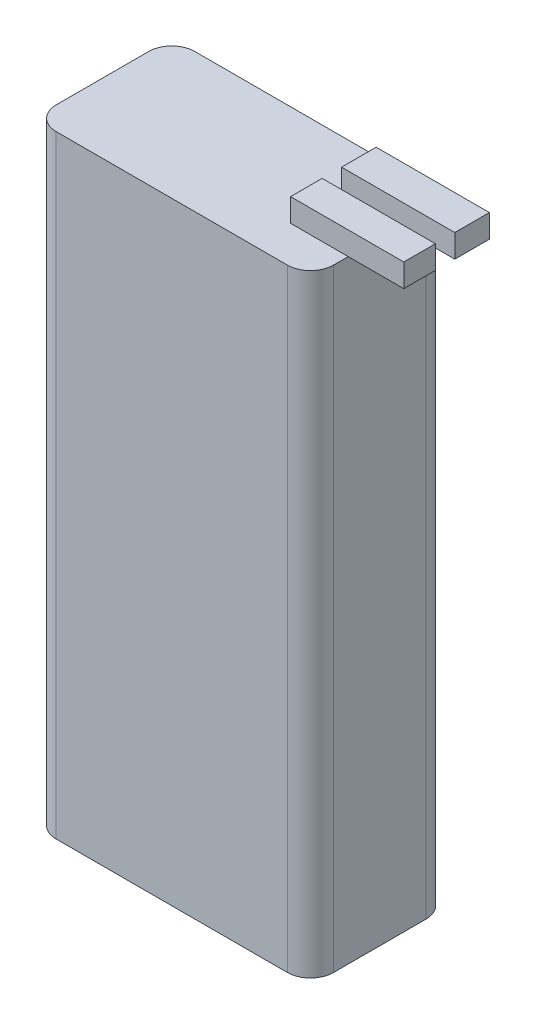
ISO-10303-21;
HEADER;
FILE_DESCRIPTION(('STEP AP214'),'2;1');
FILE_NAME('part.step','',(''),(''),'','','');
FILE_SCHEMA(('AUTOMOTIVE_DESIGN { 1 0 10303 214 1 1 1 1 }'));
ENDSEC;
DATA;
#1=APPLICATION_CONTEXT('core data for automotive mechanical design processes');
#2=APPLICATION_PROTOCOL_DEFINITION('international standard','automotive_design',2000,#1);
#3=PRODUCT_CONTEXT('',#1,'mechanical');
#4=PRODUCT('Part','Part','',(#3));
#5=PRODUCT_RELATED_PRODUCT_CATEGORY('part','',(#4));
#6=PRODUCT_DEFINITION_FORMATION('','',#4);
#7=PRODUCT_DEFINITION_CONTEXT('part definition',#1,'design');
#8=PRODUCT_DEFINITION('design','',#6,#7);
#9=PRODUCT_DEFINITION_SHAPE('','',#8);
#10=(LENGTH_UNIT() NAMED_UNIT(*) SI_UNIT(.MILLI.,.METRE.));
#11=(NAMED_UNIT(*) PLANE_ANGLE_UNIT() SI_UNIT($,.RADIAN.));
#12=(NAMED_UNIT(*) SI_UNIT($,.STERADIAN.) SOLID_ANGLE_UNIT());
#13=UNCERTAINTY_MEASURE_WITH_UNIT(LENGTH_MEASURE(1.E-05),#10,'distance_accuracy_value','');
#14=(GEOMETRIC_REPRESENTATION_CONTEXT(3) GLOBAL_UNCERTAINTY_ASSIGNED_CONTEXT((#13)) GLOBAL_UNIT_ASSIGNED_CONTEXT((#10,
#11,#12)) REPRESENTATION_CONTEXT('',''));
#15=CARTESIAN_POINT('',(0.,0.,0.));
#16=DIRECTION('',(0.,0.,1.));
#17=DIRECTION('',(1.,0.,0.));
#18=AXIS2_PLACEMENT_3D('',#15,#16,#17);
#19=CARTESIAN_POINT('',(10.,53.,4.));
#20=DIRECTION('',(0.,-1.,0.));
#21=DIRECTION('',(0.,0.,-1.));
#22=AXIS2_PLACEMENT_3D('',#19,#20,#21);
#23=PLANE('',#22);
#24=DIRECTION('',(1.,0.,0.));
#25=VECTOR('',#24,1.);
#26=CARTESIAN_POINT('',(7.01123998022979,53.,2.73246619331502));
#27=LINE('',#26,#25);
#28=CARTESIAN_POINT('',(7.01123998022979,53.,2.73246619331502));
#29=VERTEX_POINT('',#28);
#30=CARTESIAN_POINT('',(12.,53.,2.73246619331502));
#31=VERTEX_POINT('',#30);
#32=EDGE_CURVE('E57',#29,#31,#27,.T.);
#33=ORIENTED_EDGE('',*,*,#32,.F.);
#34=DIRECTION('',(0.,0.,1.));
#35=VECTOR('',#34,1.);
#36=CARTESIAN_POINT('',(7.01123998022979,53.,0.));
#37=LINE('',#36,#35);
#38=CARTESIAN_POINT('',(7.01123998022979,53.,0.));
#39=VERTEX_POINT('',#38);
#40=EDGE_CURVE('E62',#39,#29,#37,.T.);
#41=ORIENTED_EDGE('',*,*,#40,.F.);
#42=DIRECTION('',(-1.,0.,0.));
#43=VECTOR('',#42,1.);
#44=CARTESIAN_POINT('',(7.01123998022979,53.,0.));
#45=LINE('',#44,#43);
#46=CARTESIAN_POINT('',(12.,53.,0.));
#47=VERTEX_POINT('',#46);
#48=EDGE_CURVE('E379',#47,#39,#45,.T.);
#49=ORIENTED_EDGE('',*,*,#48,.F.);
#50=DIRECTION('',(0.,0.,-1.));
#51=VECTOR('',#50,1.);
#52=CARTESIAN_POINT('',(12.,53.,-3.99999999999999));
#53=LINE('',#52,#51);
#54=CARTESIAN_POINT('',(12.,53.,-1.67949374869636));
#55=VERTEX_POINT('',#54);
#56=EDGE_CURVE('E253',#47,#55,#53,.T.);
#57=ORIENTED_EDGE('',*,*,#56,.T.);
#58=DIRECTION('',(1.,0.,0.));
#59=VECTOR('',#58,1.);
#60=CARTESIAN_POINT('',(7.01123998022979,53.,-1.67949374869636));
#61=LINE('',#60,#59);
#62=CARTESIAN_POINT('',(7.01123998022979,53.,-1.67949374869636));
#63=VERTEX_POINT('',#62);
#64=EDGE_CURVE('E217',#63,#55,#61,.T.);
#65=ORIENTED_EDGE('',*,*,#64,.F.);
#66=DIRECTION('',(0.,0.,1.));
#67=VECTOR('',#66,1.);
#68=CARTESIAN_POINT('',(7.01123998022979,53.,-4.67261016044063));
#69=LINE('',#68,#67);
#70=CARTESIAN_POINT('',(7.01123998022979,53.,-4.67261016044063));
#71=VERTEX_POINT('',#70);
#72=EDGE_CURVE('E192',#71,#63,#69,.T.);
#73=ORIENTED_EDGE('',*,*,#72,.F.);
#74=DIRECTION('',(-1.,0.,0.));
#75=VECTOR('',#74,1.);
#76=CARTESIAN_POINT('',(7.01123998022979,53.,-4.67261016044063));
#77=LINE('',#76,#75);
#78=CARTESIAN_POINT('',(11.8835061911425,53.,-4.67261016044063));
#79=VERTEX_POINT('',#78);
#80=EDGE_CURVE('E11',#79,#71,#77,.T.);
#81=ORIENTED_EDGE('',*,*,#80,.F.);
#82=CARTESIAN_POINT('',(10.,53.,-4.));
#83=DIRECTION('',(0.,1.,0.));
#84=DIRECTION('',(0.,0.,1.));
#85=AXIS2_PLACEMENT_3D('',#82,#83,#84);
#86=CIRCLE('',#85,2.);
#87=CARTESIAN_POINT('',(9.99999999999999,53.,-6.));
#88=VERTEX_POINT('',#87);
#89=EDGE_CURVE('E251',#79,#88,#86,.T.);
#90=ORIENTED_EDGE('',*,*,#89,.T.);
#91=DIRECTION('',(-1.,0.,0.));
#92=VECTOR('',#91,1.);
#93=CARTESIAN_POINT('',(-9.99999999999999,53.,-6.));
#94=LINE('',#93,#92);
#95=CARTESIAN_POINT('',(-9.99999999999999,53.,-6.));
#96=VERTEX_POINT('',#95);
#97=EDGE_CURVE('E258',#88,#96,#94,.T.);
#98=ORIENTED_EDGE('',*,*,#97,.T.);
#99=CARTESIAN_POINT('',(-10.,53.,-4.));
#100=DIRECTION('',(0.,1.,0.));
#101=DIRECTION('',(0.,0.,-1.));
#102=AXIS2_PLACEMENT_3D('',#99,#100,#101);
#103=CIRCLE('',#102,2.);
#104=CARTESIAN_POINT('',(-12.,53.,-3.99999999999999));
#105=VERTEX_POINT('',#104);
#106=EDGE_CURVE('E261',#96,#105,#103,.T.);
#107=ORIENTED_EDGE('',*,*,#106,.T.);
#108=DIRECTION('',(0.,0.,1.));
#109=VECTOR('',#108,1.);
#110=CARTESIAN_POINT('',(-12.,53.,-3.99999999999999));
#111=LINE('',#110,#109);
#112=CARTESIAN_POINT('',(-12.,53.,3.99999999999999));
#113=VERTEX_POINT('',#112);
#114=EDGE_CURVE('E264',#105,#113,#111,.T.);
#115=ORIENTED_EDGE('',*,*,#114,.T.);
#116=CARTESIAN_POINT('',(-10.,53.,4.));
#117=DIRECTION('',(0.,1.,0.));
#118=DIRECTION('',(0.,0.,-1.));
#119=AXIS2_PLACEMENT_3D('',#116,#117,#118);
#120=CIRCLE('',#119,2.);
#121=CARTESIAN_POINT('',(-9.99999999999999,53.,6.));
#122=VERTEX_POINT('',#121);
#123=EDGE_CURVE('E267',#113,#122,#120,.T.);
#124=ORIENTED_EDGE('',*,*,#123,.T.);
#125=DIRECTION('',(1.,0.,0.));
#126=VECTOR('',#125,1.);
#127=CARTESIAN_POINT('',(-9.99999999999999,53.,6.));
#128=LINE('',#127,#126);
#129=CARTESIAN_POINT('',(9.99999999999999,53.,6.));
#130=VERTEX_POINT('',#129);
#131=EDGE_CURVE('E270',#122,#130,#128,.T.);
#132=ORIENTED_EDGE('',*,*,#131,.T.);
#133=CARTESIAN_POINT('',(10.,53.,4.));
#134=DIRECTION('',(0.,1.,0.));
#135=DIRECTION('',(0.,0.,-1.));
#136=AXIS2_PLACEMENT_3D('',#133,#134,#135);
#137=CIRCLE('',#136,2.);
#138=CARTESIAN_POINT('',(12.,53.,3.99999999999999));
#139=VERTEX_POINT('',#138);
#140=EDGE_CURVE('E242',#130,#139,#137,.T.);
#141=ORIENTED_EDGE('',*,*,#140,.T.);
#142=EDGE_CURVE('E248',#139,#31,#53,.T.);
#143=ORIENTED_EDGE('',*,*,#142,.T.);
#144=EDGE_LOOP('',(#33,#41,#49,#57,#65,#73,#81,#90,#98,#107,#115,#124,#132,#141,#143));
#145=FACE_BOUND('',#144,.T.);
#146=ADVANCED_FACE('F39',(#145),#23,.F.);
#147=CARTESIAN_POINT('',(10.,53.,4.));
#148=DIRECTION('',(0.,-1.,0.));
#149=DIRECTION('',(0.,0.,-1.));
#150=AXIS2_PLACEMENT_3D('',#147,#148,#149);
#151=CYLINDRICAL_SURFACE('',#150,2.);
#152=CARTESIAN_POINT('',(10.,0.,4.));
#153=DIRECTION('',(0.,1.,0.));
#154=DIRECTION('',(0.,0.,-1.));
#155=AXIS2_PLACEMENT_3D('',#152,#153,#154);
#156=CIRCLE('',#155,2.);
#157=CARTESIAN_POINT('',(9.99999999999999,0.,6.));
#158=VERTEX_POINT('',#157);
#159=CARTESIAN_POINT('',(12.,0.,3.99999999999999));
#160=VERTEX_POINT('',#159);
#161=EDGE_CURVE('E241',#158,#160,#156,.T.);
#162=ORIENTED_EDGE('',*,*,#161,.T.);
#163=DIRECTION('',(0.,-1.,0.));
#164=VECTOR('',#163,1.);
#165=CARTESIAN_POINT('',(12.,53.,3.99999999999999));
#166=LINE('',#165,#164);
#167=EDGE_CURVE('E43',#139,#160,#166,.T.);
#168=ORIENTED_EDGE('',*,*,#167,.F.);
#169=ORIENTED_EDGE('',*,*,#140,.F.);
#170=DIRECTION('',(0.,-1.,0.));
#171=VECTOR('',#170,1.);
#172=CARTESIAN_POINT('',(9.99999999999999,53.,6.));
#173=LINE('',#172,#171);
#174=EDGE_CURVE('E273',#130,#158,#173,.T.);
#175=ORIENTED_EDGE('',*,*,#174,.T.);
#176=EDGE_LOOP('',(#162,#168,#169,#175));
#177=FACE_BOUND('',#176,.T.);
#178=ADVANCED_FACE('F41',(#177),#151,.T.);
#179=CARTESIAN_POINT('',(12.,53.,-3.99999999999999));
#180=DIRECTION('',(-1.,0.,0.));
#181=DIRECTION('',(0.,0.,1.));
#182=AXIS2_PLACEMENT_3D('',#179,#180,#181);
#183=PLANE('',#182);
#184=DIRECTION('',(0.,0.,-1.));
#185=VECTOR('',#184,1.);
#186=CARTESIAN_POINT('',(12.,0.,-3.99999999999999));
#187=LINE('',#186,#185);
#188=CARTESIAN_POINT('',(12.,0.,-3.99999999999999));
#189=VERTEX_POINT('',#188);
#190=EDGE_CURVE('E277',#160,#189,#187,.T.);
#191=ORIENTED_EDGE('',*,*,#190,.T.);
#192=DIRECTION('',(0.,-1.,0.));
#193=VECTOR('',#192,1.);
#194=CARTESIAN_POINT('',(12.,53.,-3.99999999999999));
#195=LINE('',#194,#193);
#196=CARTESIAN_POINT('',(12.,53.,-3.99999999999999));
#197=VERTEX_POINT('',#196);
#198=EDGE_CURVE('E319',#197,#189,#195,.T.);
#199=ORIENTED_EDGE('',*,*,#198,.F.);
#200=EDGE_CURVE('E246',#55,#197,#53,.T.);
#201=ORIENTED_EDGE('',*,*,#200,.F.);
#202=ORIENTED_EDGE('',*,*,#56,.F.);
#203=EDGE_CURVE('E252',#31,#47,#53,.T.);
#204=ORIENTED_EDGE('',*,*,#203,.F.);
#205=ORIENTED_EDGE('',*,*,#142,.F.);
#206=ORIENTED_EDGE('',*,*,#167,.T.);
#207=EDGE_LOOP('',(#191,#199,#201,#202,#204,#205,#206));
#208=FACE_BOUND('',#207,.T.);
#209=ADVANCED_FACE('F329',(#208),#183,.F.);
#210=CARTESIAN_POINT('',(10.,53.,-4.));
#211=DIRECTION('',(0.,-1.,0.));
#212=DIRECTION('',(0.,0.,-1.));
#213=AXIS2_PLACEMENT_3D('',#210,#211,#212);
#214=CYLINDRICAL_SURFACE('',#213,2.);
#215=CARTESIAN_POINT('',(10.,0.,-4.));
#216=DIRECTION('',(0.,1.,0.));
#217=DIRECTION('',(0.,0.,1.));
#218=AXIS2_PLACEMENT_3D('',#215,#216,#217);
#219=CIRCLE('',#218,2.);
#220=CARTESIAN_POINT('',(9.99999999999999,0.,-6.));
#221=VERTEX_POINT('',#220);
#222=EDGE_CURVE('E280',#189,#221,#219,.T.);
#223=ORIENTED_EDGE('',*,*,#222,.T.);
#224=DIRECTION('',(0.,-1.,0.));
#225=VECTOR('',#224,1.);
#226=CARTESIAN_POINT('',(9.99999999999999,53.,-6.));
#227=LINE('',#226,#225);
#228=EDGE_CURVE('E316',#88,#221,#227,.T.);
#229=ORIENTED_EDGE('',*,*,#228,.F.);
#230=ORIENTED_EDGE('',*,*,#89,.F.);
#231=EDGE_CURVE('E254',#197,#79,#86,.T.);
#232=ORIENTED_EDGE('',*,*,#231,.F.);
#233=ORIENTED_EDGE('',*,*,#198,.T.);
#234=EDGE_LOOP('',(#223,#229,#230,#232,#233));
#235=FACE_BOUND('',#234,.T.);
#236=ADVANCED_FACE('F341',(#235),#214,.T.);
#237=CARTESIAN_POINT('',(-9.99999999999999,53.,-6.));
#238=DIRECTION('',(0.,0.,1.));
#239=DIRECTION('',(1.,0.,0.));
#240=AXIS2_PLACEMENT_3D('',#237,#238,#239);
#241=PLANE('',#240);
#242=DIRECTION('',(-1.,0.,0.));
#243=VECTOR('',#242,1.);
#244=CARTESIAN_POINT('',(-9.99999999999999,0.,-6.));
#245=LINE('',#244,#243);
#246=CARTESIAN_POINT('',(-9.99999999999999,0.,-6.));
#247=VERTEX_POINT('',#246);
#248=EDGE_CURVE('E283',#221,#247,#245,.T.);
#249=ORIENTED_EDGE('',*,*,#248,.T.);
#250=DIRECTION('',(0.,-1.,0.));
#251=VECTOR('',#250,1.);
#252=CARTESIAN_POINT('',(-9.99999999999999,53.,-6.));
#253=LINE('',#252,#251);
#254=EDGE_CURVE('E312',#96,#247,#253,.T.);
#255=ORIENTED_EDGE('',*,*,#254,.F.);
#256=ORIENTED_EDGE('',*,*,#97,.F.);
#257=ORIENTED_EDGE('',*,*,#228,.T.);
#258=EDGE_LOOP('',(#249,#255,#256,#257));
#259=FACE_BOUND('',#258,.T.);
#260=ADVANCED_FACE('F345',(#259),#241,.F.);
#261=CARTESIAN_POINT('',(-10.,53.,-4.));
#262=DIRECTION('',(0.,-1.,0.));
#263=DIRECTION('',(0.,0.,-1.));
#264=AXIS2_PLACEMENT_3D('',#261,#262,#263);
#265=CYLINDRICAL_SURFACE('',#264,2.);
#266=CARTESIAN_POINT('',(-10.,0.,-4.));
#267=DIRECTION('',(0.,1.,0.));
#268=DIRECTION('',(0.,0.,-1.));
#269=AXIS2_PLACEMENT_3D('',#266,#267,#268);
#270=CIRCLE('',#269,2.);
#271=CARTESIAN_POINT('',(-12.,0.,-3.99999999999999));
#272=VERTEX_POINT('',#271);
#273=EDGE_CURVE('E286',#247,#272,#270,.T.);
#274=ORIENTED_EDGE('',*,*,#273,.T.);
#275=DIRECTION('',(0.,-1.,0.));
#276=VECTOR('',#275,1.);
#277=CARTESIAN_POINT('',(-12.,53.,-3.99999999999999));
#278=LINE('',#277,#276);
#279=EDGE_CURVE('E308',#105,#272,#278,.T.);
#280=ORIENTED_EDGE('',*,*,#279,.F.);
#281=ORIENTED_EDGE('',*,*,#106,.F.);
#282=ORIENTED_EDGE('',*,*,#254,.T.);
#283=EDGE_LOOP('',(#274,#280,#281,#282));
#284=FACE_BOUND('',#283,.T.);
#285=ADVANCED_FACE('F440',(#284),#265,.T.);
#286=CARTESIAN_POINT('',(-12.,53.,-3.99999999999999));
#287=DIRECTION('',(1.,0.,0.));
#288=DIRECTION('',(0.,0.,-1.));
#289=AXIS2_PLACEMENT_3D('',#286,#287,#288);
#290=PLANE('',#289);
#291=DIRECTION('',(0.,0.,1.));
#292=VECTOR('',#291,1.);
#293=CARTESIAN_POINT('',(-12.,0.,-3.99999999999999));
#294=LINE('',#293,#292);
#295=CARTESIAN_POINT('',(-12.,0.,3.99999999999999));
#296=VERTEX_POINT('',#295);
#297=EDGE_CURVE('E289',#272,#296,#294,.T.);
#298=ORIENTED_EDGE('',*,*,#297,.T.);
#299=DIRECTION('',(0.,-1.,0.));
#300=VECTOR('',#299,1.);
#301=CARTESIAN_POINT('',(-12.,53.,3.99999999999999));
#302=LINE('',#301,#300);
#303=EDGE_CURVE('E304',#113,#296,#302,.T.);
#304=ORIENTED_EDGE('',*,*,#303,.F.);
#305=ORIENTED_EDGE('',*,*,#114,.F.);
#306=ORIENTED_EDGE('',*,*,#279,.T.);
#307=EDGE_LOOP('',(#298,#304,#305,#306));
#308=FACE_BOUND('',#307,.T.);
#309=ADVANCED_FACE('F436',(#308),#290,.F.);
#310=CARTESIAN_POINT('',(-10.,53.,4.));
#311=DIRECTION('',(0.,-1.,0.));
#312=DIRECTION('',(0.,0.,-1.));
#313=AXIS2_PLACEMENT_3D('',#310,#311,#312);
#314=CYLINDRICAL_SURFACE('',#313,2.);
#315=CARTESIAN_POINT('',(-10.,0.,4.));
#316=DIRECTION('',(0.,1.,0.));
#317=DIRECTION('',(0.,0.,-1.));
#318=AXIS2_PLACEMENT_3D('',#315,#316,#317);
#319=CIRCLE('',#318,2.);
#320=CARTESIAN_POINT('',(-9.99999999999999,0.,6.));
#321=VERTEX_POINT('',#320);
#322=EDGE_CURVE('E292',#296,#321,#319,.T.);
#323=ORIENTED_EDGE('',*,*,#322,.T.);
#324=DIRECTION('',(0.,-1.,0.));
#325=VECTOR('',#324,1.);
#326=CARTESIAN_POINT('',(-9.99999999999999,53.,6.));
#327=LINE('',#326,#325);
#328=EDGE_CURVE('E300',#122,#321,#327,.T.);
#329=ORIENTED_EDGE('',*,*,#328,.F.);
#330=ORIENTED_EDGE('',*,*,#123,.F.);
#331=ORIENTED_EDGE('',*,*,#303,.T.);
#332=EDGE_LOOP('',(#323,#329,#330,#331));
#333=FACE_BOUND('',#332,.T.);
#334=ADVANCED_FACE('F432',(#333),#314,.T.);
#335=CARTESIAN_POINT('',(-9.99999999999999,53.,6.));
#336=DIRECTION('',(0.,0.,-1.));
#337=DIRECTION('',(-1.,0.,0.));
#338=AXIS2_PLACEMENT_3D('',#335,#336,#337);
#339=PLANE('',#338);
#340=DIRECTION('',(1.,0.,0.));
#341=VECTOR('',#340,1.);
#342=CARTESIAN_POINT('',(-9.99999999999999,0.,6.));
#343=LINE('',#342,#341);
#344=EDGE_CURVE('E247',#321,#158,#343,.T.);
#345=ORIENTED_EDGE('',*,*,#344,.T.);
#346=ORIENTED_EDGE('',*,*,#174,.F.);
#347=ORIENTED_EDGE('',*,*,#131,.F.);
#348=ORIENTED_EDGE('',*,*,#328,.T.);
#349=EDGE_LOOP('',(#345,#346,#347,#348));
#350=FACE_BOUND('',#349,.T.);
#351=ADVANCED_FACE('F429',(#350),#339,.F.);
#352=CARTESIAN_POINT('',(10.,0.,4.));
#353=DIRECTION('',(0.,-1.,0.));
#354=DIRECTION('',(0.,0.,-1.));
#355=AXIS2_PLACEMENT_3D('',#352,#353,#354);
#356=PLANE('',#355);
#357=ORIENTED_EDGE('',*,*,#161,.F.);
#358=ORIENTED_EDGE('',*,*,#344,.F.);
#359=ORIENTED_EDGE('',*,*,#322,.F.);
#360=ORIENTED_EDGE('',*,*,#297,.F.);
#361=ORIENTED_EDGE('',*,*,#273,.F.);
#362=ORIENTED_EDGE('',*,*,#248,.F.);
#363=ORIENTED_EDGE('',*,*,#222,.F.);
#364=ORIENTED_EDGE('',*,*,#190,.F.);
#365=EDGE_LOOP('',(#357,#358,#359,#360,#361,#362,#363,#364));
#366=FACE_BOUND('',#365,.T.);
#367=ADVANCED_FACE('F336',(#366),#356,.T.);
#368=CARTESIAN_POINT('',(0.,53.,0.));
#369=DIRECTION('',(0.,1.,0.));
#370=DIRECTION('',(0.,0.,1.));
#371=AXIS2_PLACEMENT_3D('',#368,#369,#370);
#372=PLANE('',#371);
#373=CARTESIAN_POINT('',(16.8041392217333,53.,-1.67949374869636));
#374=VERTEX_POINT('',#373);
#375=EDGE_CURVE('E197',#55,#374,#61,.T.);
#376=ORIENTED_EDGE('',*,*,#375,.F.);
#377=ORIENTED_EDGE('',*,*,#200,.T.);
#378=ORIENTED_EDGE('',*,*,#231,.T.);
#379=CARTESIAN_POINT('',(16.8041392217333,53.,-4.67261016044063));
#380=VERTEX_POINT('',#379);
#381=EDGE_CURVE('E50',#380,#79,#77,.T.);
#382=ORIENTED_EDGE('',*,*,#381,.F.);
#383=DIRECTION('',(0.,0.,-1.));
#384=VECTOR('',#383,1.);
#385=CARTESIAN_POINT('',(16.8041392217333,53.,-4.67261016044063));
#386=LINE('',#385,#384);
#387=EDGE_CURVE('E221',#374,#380,#386,.T.);
#388=ORIENTED_EDGE('',*,*,#387,.F.);
#389=EDGE_LOOP('',(#376,#377,#378,#382,#388));
#390=FACE_BOUND('',#389,.T.);
#391=ADVANCED_FACE('F367',(#390),#372,.F.);
#392=CARTESIAN_POINT('',(7.01123998022979,55.,-4.67261016044063));
#393=DIRECTION('',(1.,0.,0.));
#394=DIRECTION('',(0.,0.,-1.));
#395=AXIS2_PLACEMENT_3D('',#392,#393,#394);
#396=PLANE('',#395);
#397=ORIENTED_EDGE('',*,*,#72,.T.);
#398=DIRECTION('',(0.,-1.,0.));
#399=VECTOR('',#398,1.);
#400=CARTESIAN_POINT('',(7.01123998022979,55.,-1.67949374869636));
#401=LINE('',#400,#399);
#402=CARTESIAN_POINT('',(7.01123998022979,55.,-1.67949374869636));
#403=VERTEX_POINT('',#402);
#404=EDGE_CURVE('E237',#403,#63,#401,.T.);
#405=ORIENTED_EDGE('',*,*,#404,.F.);
#406=DIRECTION('',(0.,0.,1.));
#407=VECTOR('',#406,1.);
#408=CARTESIAN_POINT('',(7.01123998022979,55.,-4.67261016044063));
#409=LINE('',#408,#407);
#410=CARTESIAN_POINT('',(7.01123998022979,55.,-4.67261016044063));
#411=VERTEX_POINT('',#410);
#412=EDGE_CURVE('E203',#411,#403,#409,.T.);
#413=ORIENTED_EDGE('',*,*,#412,.F.);
#414=DIRECTION('',(0.,-1.,0.));
#415=VECTOR('',#414,1.);
#416=CARTESIAN_POINT('',(7.01123998022979,55.,-4.67261016044063));
#417=LINE('',#416,#415);
#418=EDGE_CURVE('E215',#411,#71,#417,.T.);
#419=ORIENTED_EDGE('',*,*,#418,.T.);
#420=EDGE_LOOP('',(#397,#405,#413,#419));
#421=FACE_BOUND('',#420,.T.);
#422=ADVANCED_FACE('F377',(#421),#396,.F.);
#423=CARTESIAN_POINT('',(7.01123998022979,55.,-1.67949374869636));
#424=DIRECTION('',(0.,0.,-1.));
#425=DIRECTION('',(-1.,0.,0.));
#426=AXIS2_PLACEMENT_3D('',#423,#424,#425);
#427=PLANE('',#426);
#428=ORIENTED_EDGE('',*,*,#64,.T.);
#429=ORIENTED_EDGE('',*,*,#375,.T.);
#430=DIRECTION('',(0.,-1.,0.));
#431=VECTOR('',#430,1.);
#432=CARTESIAN_POINT('',(16.8041392217333,55.,-1.67949374869636));
#433=LINE('',#432,#431);
#434=CARTESIAN_POINT('',(16.8041392217333,55.,-1.67949374869636));
#435=VERTEX_POINT('',#434);
#436=EDGE_CURVE('E233',#435,#374,#433,.T.);
#437=ORIENTED_EDGE('',*,*,#436,.F.);
#438=DIRECTION('',(1.,0.,0.));
#439=VECTOR('',#438,1.);
#440=CARTESIAN_POINT('',(7.01123998022979,55.,-1.67949374869636));
#441=LINE('',#440,#439);
#442=EDGE_CURVE('E207',#403,#435,#441,.T.);
#443=ORIENTED_EDGE('',*,*,#442,.F.);
#444=ORIENTED_EDGE('',*,*,#404,.T.);
#445=EDGE_LOOP('',(#428,#429,#437,#443,#444));
#446=FACE_BOUND('',#445,.T.);
#447=ADVANCED_FACE('F359',(#446),#427,.F.);
#448=CARTESIAN_POINT('',(16.8041392217333,55.,-4.67261016044063));
#449=DIRECTION('',(-1.,0.,0.));
#450=DIRECTION('',(0.,0.,1.));
#451=AXIS2_PLACEMENT_3D('',#448,#449,#450);
#452=PLANE('',#451);
#453=ORIENTED_EDGE('',*,*,#387,.T.);
#454=DIRECTION('',(0.,-1.,0.));
#455=VECTOR('',#454,1.);
#456=CARTESIAN_POINT('',(16.8041392217333,55.,-4.67261016044063));
#457=LINE('',#456,#455);
#458=CARTESIAN_POINT('',(16.8041392217333,55.,-4.67261016044063));
#459=VERTEX_POINT('',#458);
#460=EDGE_CURVE('E229',#459,#380,#457,.T.);
#461=ORIENTED_EDGE('',*,*,#460,.F.);
#462=DIRECTION('',(0.,0.,-1.));
#463=VECTOR('',#462,1.);
#464=CARTESIAN_POINT('',(16.8041392217333,55.,-4.67261016044063));
#465=LINE('',#464,#463);
#466=EDGE_CURVE('E210',#435,#459,#465,.T.);
#467=ORIENTED_EDGE('',*,*,#466,.F.);
#468=ORIENTED_EDGE('',*,*,#436,.T.);
#469=EDGE_LOOP('',(#453,#461,#467,#468));
#470=FACE_BOUND('',#469,.T.);
#471=ADVANCED_FACE('F364',(#470),#452,.F.);
#472=CARTESIAN_POINT('',(7.01123998022979,55.,-4.67261016044063));
#473=DIRECTION('',(0.,0.,1.));
#474=DIRECTION('',(1.,0.,0.));
#475=AXIS2_PLACEMENT_3D('',#472,#473,#474);
#476=PLANE('',#475);
#477=ORIENTED_EDGE('',*,*,#381,.T.);
#478=ORIENTED_EDGE('',*,*,#80,.T.);
#479=ORIENTED_EDGE('',*,*,#418,.F.);
#480=DIRECTION('',(-1.,0.,0.));
#481=VECTOR('',#480,1.);
#482=CARTESIAN_POINT('',(7.01123998022979,55.,-4.67261016044063));
#483=LINE('',#482,#481);
#484=EDGE_CURVE('E213',#459,#411,#483,.T.);
#485=ORIENTED_EDGE('',*,*,#484,.F.);
#486=ORIENTED_EDGE('',*,*,#460,.T.);
#487=EDGE_LOOP('',(#477,#478,#479,#485,#486));
#488=FACE_BOUND('',#487,.T.);
#489=ADVANCED_FACE('F369',(#488),#476,.F.);
#490=CARTESIAN_POINT('',(0.,55.,0.));
#491=DIRECTION('',(0.,1.,0.));
#492=DIRECTION('',(0.,0.,1.));
#493=AXIS2_PLACEMENT_3D('',#490,#491,#492);
#494=PLANE('',#493);
#495=ORIENTED_EDGE('',*,*,#412,.T.);
#496=ORIENTED_EDGE('',*,*,#442,.T.);
#497=ORIENTED_EDGE('',*,*,#466,.T.);
#498=ORIENTED_EDGE('',*,*,#484,.T.);
#499=EDGE_LOOP('',(#495,#496,#497,#498));
#500=FACE_BOUND('',#499,.T.);
#501=ADVANCED_FACE('F374',(#500),#494,.T.);
#502=CARTESIAN_POINT('',(0.,53.,0.));
#503=DIRECTION('',(0.,1.,0.));
#504=DIRECTION('',(0.,0.,1.));
#505=AXIS2_PLACEMENT_3D('',#502,#503,#504);
#506=PLANE('',#505);
#507=CARTESIAN_POINT('',(16.8041392217333,53.,2.73246619331502));
#508=VERTEX_POINT('',#507);
#509=EDGE_CURVE('E385',#31,#508,#27,.T.);
#510=ORIENTED_EDGE('',*,*,#509,.F.);
#511=ORIENTED_EDGE('',*,*,#203,.T.);
#512=CARTESIAN_POINT('',(16.8041392217333,53.,0.));
#513=VERTEX_POINT('',#512);
#514=EDGE_CURVE('E188',#513,#47,#45,.T.);
#515=ORIENTED_EDGE('',*,*,#514,.F.);
#516=DIRECTION('',(0.,0.,-1.));
#517=VECTOR('',#516,1.);
#518=CARTESIAN_POINT('',(16.8041392217333,53.,0.));
#519=LINE('',#518,#517);
#520=EDGE_CURVE('E387',#508,#513,#519,.T.);
#521=ORIENTED_EDGE('',*,*,#520,.F.);
#522=EDGE_LOOP('',(#510,#511,#515,#521));
#523=FACE_BOUND('',#522,.T.);
#524=ADVANCED_FACE('F386',(#523),#506,.F.);
#525=CARTESIAN_POINT('',(7.01123998022979,55.,0.));
#526=DIRECTION('',(1.,0.,0.));
#527=DIRECTION('',(0.,0.,-1.));
#528=AXIS2_PLACEMENT_3D('',#525,#526,#527);
#529=PLANE('',#528);
#530=ORIENTED_EDGE('',*,*,#40,.T.);
#531=DIRECTION('',(0.,-1.,0.));
#532=VECTOR('',#531,1.);
#533=CARTESIAN_POINT('',(7.01123998022979,55.,2.73246619331502));
#534=LINE('',#533,#532);
#535=CARTESIAN_POINT('',(7.01123998022979,55.,2.73246619331502));
#536=VERTEX_POINT('',#535);
#537=EDGE_CURVE('E171',#536,#29,#534,.T.);
#538=ORIENTED_EDGE('',*,*,#537,.F.);
#539=DIRECTION('',(0.,0.,1.));
#540=VECTOR('',#539,1.);
#541=CARTESIAN_POINT('',(7.01123998022979,55.,0.));
#542=LINE('',#541,#540);
#543=CARTESIAN_POINT('',(7.01123998022979,55.,0.));
#544=VERTEX_POINT('',#543);
#545=EDGE_CURVE('E178',#544,#536,#542,.T.);
#546=ORIENTED_EDGE('',*,*,#545,.F.);
#547=DIRECTION('',(0.,-1.,0.));
#548=VECTOR('',#547,1.);
#549=CARTESIAN_POINT('',(7.01123998022979,55.,0.));
#550=LINE('',#549,#548);
#551=EDGE_CURVE('E398',#544,#39,#550,.T.);
#552=ORIENTED_EDGE('',*,*,#551,.T.);
#553=EDGE_LOOP('',(#530,#538,#546,#552));
#554=FACE_BOUND('',#553,.T.);
#555=ADVANCED_FACE('F190',(#554),#529,.F.);
#556=CARTESIAN_POINT('',(7.01123998022979,55.,2.73246619331502));
#557=DIRECTION('',(0.,0.,-1.));
#558=DIRECTION('',(-1.,0.,0.));
#559=AXIS2_PLACEMENT_3D('',#556,#557,#558);
#560=PLANE('',#559);
#561=ORIENTED_EDGE('',*,*,#32,.T.);
#562=ORIENTED_EDGE('',*,*,#509,.T.);
#563=DIRECTION('',(0.,-1.,0.));
#564=VECTOR('',#563,1.);
#565=CARTESIAN_POINT('',(16.8041392217333,55.,2.73246619331502));
#566=LINE('',#565,#564);
#567=CARTESIAN_POINT('',(16.8041392217333,55.,2.73246619331502));
#568=VERTEX_POINT('',#567);
#569=EDGE_CURVE('E173',#568,#508,#566,.T.);
#570=ORIENTED_EDGE('',*,*,#569,.F.);
#571=DIRECTION('',(1.,0.,0.));
#572=VECTOR('',#571,1.);
#573=CARTESIAN_POINT('',(7.01123998022979,55.,2.73246619331502));
#574=LINE('',#573,#572);
#575=EDGE_CURVE('E167',#536,#568,#574,.T.);
#576=ORIENTED_EDGE('',*,*,#575,.F.);
#577=ORIENTED_EDGE('',*,*,#537,.T.);
#578=EDGE_LOOP('',(#561,#562,#570,#576,#577));
#579=FACE_BOUND('',#578,.T.);
#580=ADVANCED_FACE('F169',(#579),#560,.F.);
#581=CARTESIAN_POINT('',(16.8041392217333,55.,0.));
#582=DIRECTION('',(-1.,0.,0.));
#583=DIRECTION('',(0.,0.,1.));
#584=AXIS2_PLACEMENT_3D('',#581,#582,#583);
#585=PLANE('',#584);
#586=ORIENTED_EDGE('',*,*,#520,.T.);
#587=DIRECTION('',(0.,-1.,0.));
#588=VECTOR('',#587,1.);
#589=CARTESIAN_POINT('',(16.8041392217333,55.,0.));
#590=LINE('',#589,#588);
#591=CARTESIAN_POINT('',(16.8041392217333,55.,0.));
#592=VERTEX_POINT('',#591);
#593=EDGE_CURVE('E199',#592,#513,#590,.T.);
#594=ORIENTED_EDGE('',*,*,#593,.F.);
#595=DIRECTION('',(0.,0.,-1.));
#596=VECTOR('',#595,1.);
#597=CARTESIAN_POINT('',(16.8041392217333,55.,0.));
#598=LINE('',#597,#596);
#599=EDGE_CURVE('E177',#568,#592,#598,.T.);
#600=ORIENTED_EDGE('',*,*,#599,.F.);
#601=ORIENTED_EDGE('',*,*,#569,.T.);
#602=EDGE_LOOP('',(#586,#594,#600,#601));
#603=FACE_BOUND('',#602,.T.);
#604=ADVANCED_FACE('F406',(#603),#585,.F.);
#605=CARTESIAN_POINT('',(7.01123998022979,55.,0.));
#606=DIRECTION('',(0.,0.,1.));
#607=DIRECTION('',(1.,0.,0.));
#608=AXIS2_PLACEMENT_3D('',#605,#606,#607);
#609=PLANE('',#608);
#610=ORIENTED_EDGE('',*,*,#514,.T.);
#611=ORIENTED_EDGE('',*,*,#48,.T.);
#612=ORIENTED_EDGE('',*,*,#551,.F.);
#613=DIRECTION('',(-1.,0.,0.));
#614=VECTOR('',#613,1.);
#615=CARTESIAN_POINT('',(7.01123998022979,55.,0.));
#616=LINE('',#615,#614);
#617=EDGE_CURVE('E183',#592,#544,#616,.T.);
#618=ORIENTED_EDGE('',*,*,#617,.F.);
#619=ORIENTED_EDGE('',*,*,#593,.T.);
#620=EDGE_LOOP('',(#610,#611,#612,#618,#619));
#621=FACE_BOUND('',#620,.T.);
#622=ADVANCED_FACE('F404',(#621),#609,.F.);
#623=CARTESIAN_POINT('',(0.,55.,0.));
#624=DIRECTION('',(0.,1.,0.));
#625=DIRECTION('',(0.,0.,1.));
#626=AXIS2_PLACEMENT_3D('',#623,#624,#625);
#627=PLANE('',#626);
#628=ORIENTED_EDGE('',*,*,#545,.T.);
#629=ORIENTED_EDGE('',*,*,#575,.T.);
#630=ORIENTED_EDGE('',*,*,#599,.T.);
#631=ORIENTED_EDGE('',*,*,#617,.T.);
#632=EDGE_LOOP('',(#628,#629,#630,#631));
#633=FACE_BOUND('',#632,.T.);
#634=ADVANCED_FACE('F181',(#633),#627,.T.);
#635=CLOSED_SHELL('',(#146,#178,#209,#236,#260,#285,#309,#334,#351,#367,#391,#422,#447,#471,
#489,#501,#524,#555,#580,#604,#622,#634));
#636=MANIFOLD_SOLID_BREP('B2',#635);
#637=ADVANCED_BREP_SHAPE_REPRESENTATION('',(#18,#636),#14);
#638=SHAPE_DEFINITION_REPRESENTATION(#9,#637);
ENDSEC;
END-ISO-10303-21;
